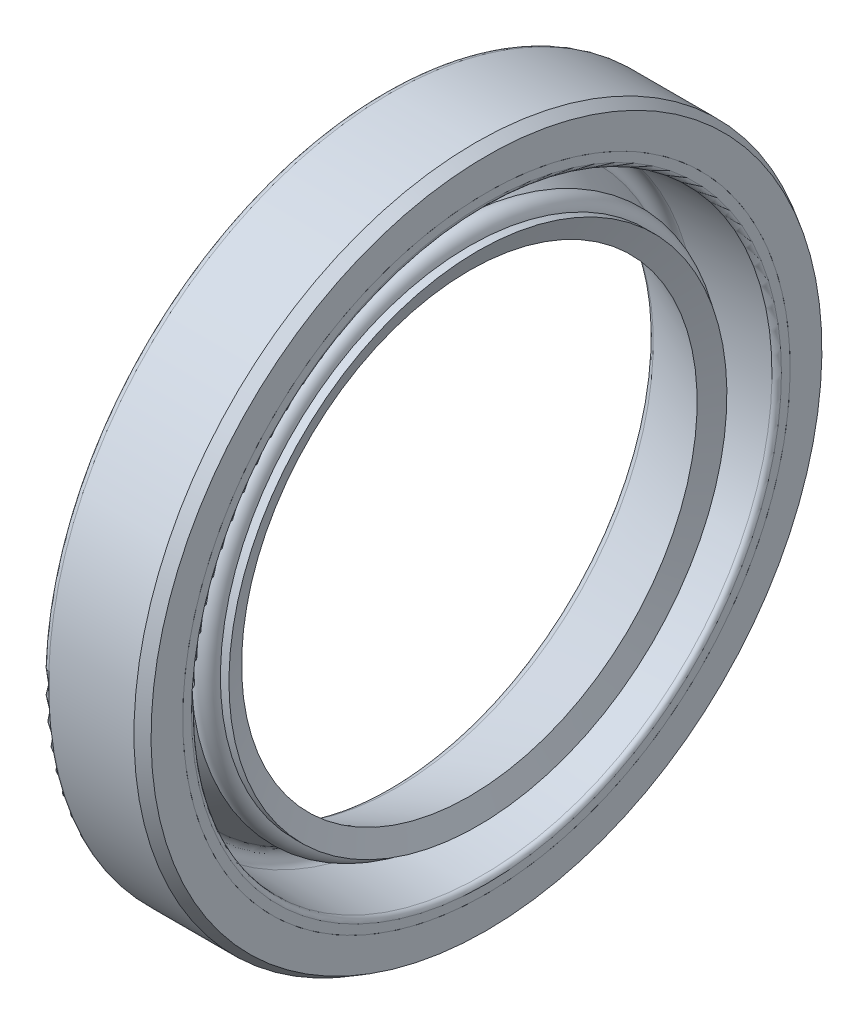
ISO-10303-21;
HEADER;
FILE_DESCRIPTION(('STEP AP214'),'2;1');
FILE_NAME('part.step','',(''),(''),'','','');
FILE_SCHEMA(('AUTOMOTIVE_DESIGN { 1 0 10303 214 1 1 1 1 }'));
ENDSEC;
DATA;
#1=APPLICATION_CONTEXT('core data for automotive mechanical design processes');
#2=APPLICATION_PROTOCOL_DEFINITION('international standard','automotive_design',2000,#1);
#3=PRODUCT_CONTEXT('',#1,'mechanical');
#4=PRODUCT('Part','Part','',(#3));
#5=PRODUCT_RELATED_PRODUCT_CATEGORY('part','',(#4));
#6=PRODUCT_DEFINITION_FORMATION('','',#4);
#7=PRODUCT_DEFINITION_CONTEXT('part definition',#1,'design');
#8=PRODUCT_DEFINITION('design','',#6,#7);
#9=PRODUCT_DEFINITION_SHAPE('','',#8);
#10=(LENGTH_UNIT() NAMED_UNIT(*) SI_UNIT(.MILLI.,.METRE.));
#11=(NAMED_UNIT(*) PLANE_ANGLE_UNIT() SI_UNIT($,.RADIAN.));
#12=(NAMED_UNIT(*) SI_UNIT($,.STERADIAN.) SOLID_ANGLE_UNIT());
#13=UNCERTAINTY_MEASURE_WITH_UNIT(LENGTH_MEASURE(1.E-05),#10,'distance_accuracy_value','');
#14=(GEOMETRIC_REPRESENTATION_CONTEXT(3) GLOBAL_UNCERTAINTY_ASSIGNED_CONTEXT((#13)) GLOBAL_UNIT_ASSIGNED_CONTEXT((#10,
#11,#12)) REPRESENTATION_CONTEXT('',''));
#15=CARTESIAN_POINT('',(0.,0.,0.));
#16=DIRECTION('',(0.,0.,1.));
#17=DIRECTION('',(1.,0.,0.));
#18=AXIS2_PLACEMENT_3D('',#15,#16,#17);
#19=CARTESIAN_POINT('',(10.1408439473113,0.,0.));
#20=DIRECTION('',(-1.,0.,0.));
#21=DIRECTION('',(0.,0.,1.));
#22=AXIS2_PLACEMENT_3D('',#19,#20,#21);
#23=TOROIDAL_SURFACE('',#22,34.502972869853,1.787525);
#24=CARTESIAN_POINT('',(10.1408439473113,0.,36.290497869853));
#25=VERTEX_POINT('',#24);
#26=VERTEX_LOOP('',#25);
#27=FACE_BOUND('',#26,.T.);
#28=ADVANCED_FACE('F54',(#27),#23,.T.);
#29=CLOSED_SHELL('',(#28));
#30=MANIFOLD_SOLID_BREP('B2',#29);
#31=CARTESIAN_POINT('',(3.51549062980086,0.,0.));
#32=DIRECTION('',(1.,0.,0.));
#33=DIRECTION('',(0.,1.,0.));
#34=AXIS2_PLACEMENT_3D('',#31,#32,#33);
#35=CONICAL_SURFACE('',#34,40.093772548186,0.0349065850398807);
#36=CARTESIAN_POINT('',(13.6532720210662,0.,0.));
#37=DIRECTION('',(1.,0.,0.));
#38=DIRECTION('',(0.,1.,0.));
#39=AXIS2_PLACEMENT_3D('',#36,#37,#38);
#40=CIRCLE('',#39,40.4477916753081);
#41=CARTESIAN_POINT('',(13.6532720210662,40.4477916753081,0.));
#42=VERTEX_POINT('',#41);
#43=EDGE_CURVE('E53',#42,#42,#40,.T.);
#44=ORIENTED_EDGE('',*,*,#43,.T.);
#45=EDGE_LOOP('',(#44));
#46=FACE_BOUND('',#45,.T.);
#47=CARTESIAN_POINT('',(3.51549062980086,0.,0.));
#48=DIRECTION('',(1.,0.,0.));
#49=DIRECTION('',(0.,1.,0.));
#50=AXIS2_PLACEMENT_3D('',#47,#48,#49);
#51=CIRCLE('',#50,40.093772548186);
#52=CARTESIAN_POINT('',(3.51549062980086,40.093772548186,0.));
#53=VERTEX_POINT('',#52);
#54=EDGE_CURVE('E119',#53,#53,#51,.T.);
#55=ORIENTED_EDGE('',*,*,#54,.F.);
#56=EDGE_LOOP('',(#55));
#57=FACE_BOUND('',#56,.T.);
#58=ADVANCED_FACE('F79',(#46,#57),#35,.F.);
#59=CARTESIAN_POINT('',(13.629878125,0.,0.));
#60=DIRECTION('',(1.,0.,0.));
#61=DIRECTION('',(0.,1.,0.));
#62=AXIS2_PLACEMENT_3D('',#59,#60,#61);
#63=TOROIDAL_SURFACE('',#62,41.1177052083333,0.670321875000005);
#64=CARTESIAN_POINT('',(14.3002,0.,0.));
#65=DIRECTION('',(1.,0.,0.));
#66=DIRECTION('',(0.,1.,0.));
#67=AXIS2_PLACEMENT_3D('',#64,#65,#66);
#68=CIRCLE('',#67,41.1177052083333);
#69=CARTESIAN_POINT('',(14.3002,41.1177052083333,0.));
#70=VERTEX_POINT('',#69);
#71=EDGE_CURVE('E85',#70,#70,#68,.T.);
#72=ORIENTED_EDGE('',*,*,#71,.T.);
#73=EDGE_LOOP('',(#72));
#74=FACE_BOUND('',#73,.T.);
#75=ORIENTED_EDGE('',*,*,#43,.F.);
#76=EDGE_LOOP('',(#75));
#77=FACE_BOUND('',#76,.T.);
#78=ADVANCED_FACE('F127',(#74,#77),#63,.T.);
#79=CARTESIAN_POINT('',(14.3002,0.,0.));
#80=DIRECTION('',(1.,0.,0.));
#81=DIRECTION('',(0.,1.,0.));
#82=AXIS2_PLACEMENT_3D('',#79,#80,#81);
#83=PLANE('',#82);
#84=CARTESIAN_POINT('',(14.3002,0.,0.));
#85=DIRECTION('',(1.,0.,0.));
#86=DIRECTION('',(0.,1.,0.));
#87=AXIS2_PLACEMENT_3D('',#84,#85,#86);
#88=CIRCLE('',#87,42.3333333333333);
#89=CARTESIAN_POINT('',(14.3002,42.3333333333333,0.));
#90=VERTEX_POINT('',#89);
#91=EDGE_CURVE('E89',#90,#90,#88,.T.);
#92=ORIENTED_EDGE('',*,*,#91,.T.);
#93=EDGE_LOOP('',(#92));
#94=FACE_BOUND('',#93,.T.);
#95=ORIENTED_EDGE('',*,*,#71,.F.);
#96=EDGE_LOOP('',(#95));
#97=FACE_BOUND('',#96,.T.);
#98=ADVANCED_FACE('F131',(#94,#97),#83,.T.);
#99=CARTESIAN_POINT('',(14.3002,0.,0.));
#100=DIRECTION('',(1.,0.,0.));
#101=DIRECTION('',(0.,1.,0.));
#102=AXIS2_PLACEMENT_3D('',#99,#100,#101);
#103=CYLINDRICAL_SURFACE('',#102,42.3333333333333);
#104=CARTESIAN_POINT('',(0.,0.,0.));
#105=DIRECTION('',(1.,0.,0.));
#106=DIRECTION('',(0.,1.,0.));
#107=AXIS2_PLACEMENT_3D('',#104,#105,#106);
#108=CIRCLE('',#107,42.3333333333333);
#109=CARTESIAN_POINT('',(0.,42.3333333333333,0.));
#110=VERTEX_POINT('',#109);
#111=EDGE_CURVE('E93',#110,#110,#108,.T.);
#112=ORIENTED_EDGE('',*,*,#111,.T.);
#113=EDGE_LOOP('',(#112));
#114=FACE_BOUND('',#113,.T.);
#115=ORIENTED_EDGE('',*,*,#91,.F.);
#116=EDGE_LOOP('',(#115));
#117=FACE_BOUND('',#116,.T.);
#118=ADVANCED_FACE('F135',(#114,#117),#103,.T.);
#119=CARTESIAN_POINT('',(0.,0.,0.));
#120=DIRECTION('',(-1.,0.,0.));
#121=DIRECTION('',(0.,-1.,0.));
#122=AXIS2_PLACEMENT_3D('',#119,#120,#121);
#123=PLANE('',#122);
#124=CARTESIAN_POINT('',(0.,0.,0.));
#125=DIRECTION('',(1.,0.,0.));
#126=DIRECTION('',(0.,1.,0.));
#127=AXIS2_PLACEMENT_3D('',#124,#125,#126);
#128=CIRCLE('',#127,38.3645833333333);
#129=CARTESIAN_POINT('',(0.,38.3645833333333,0.));
#130=VERTEX_POINT('',#129);
#131=EDGE_CURVE('E98',#130,#130,#128,.T.);
#132=ORIENTED_EDGE('',*,*,#131,.T.);
#133=EDGE_LOOP('',(#132));
#134=FACE_BOUND('',#133,.T.);
#135=ORIENTED_EDGE('',*,*,#111,.F.);
#136=EDGE_LOOP('',(#135));
#137=FACE_BOUND('',#136,.T.);
#138=ADVANCED_FACE('F142',(#134,#137),#123,.T.);
#139=CARTESIAN_POINT('',(2.6812875,0.,0.));
#140=DIRECTION('',(1.,0.,0.));
#141=DIRECTION('',(0.,1.,0.));
#142=AXIS2_PLACEMENT_3D('',#139,#140,#141);
#143=TOROIDAL_SURFACE('',#142,38.3645833333333,2.6812875);
#144=CARTESIAN_POINT('',(1.67867231544544,0.,0.));
#145=DIRECTION('',(1.,0.,0.));
#146=DIRECTION('',(0.,1.,0.));
#147=AXIS2_PLACEMENT_3D('',#144,#145,#146);
#148=CIRCLE('',#147,35.8778052070509);
#149=CARTESIAN_POINT('',(1.67867231544544,35.8778052070509,0.));
#150=VERTEX_POINT('',#149);
#151=EDGE_CURVE('E101',#150,#150,#148,.T.);
#152=ORIENTED_EDGE('',*,*,#151,.T.);
#153=EDGE_LOOP('',(#152));
#154=FACE_BOUND('',#153,.T.);
#155=ORIENTED_EDGE('',*,*,#131,.F.);
#156=EDGE_LOOP('',(#155));
#157=FACE_BOUND('',#156,.T.);
#158=ADVANCED_FACE('F146',(#154,#157),#143,.T.);
#159=CARTESIAN_POINT('',(1.67867231544544,0.,0.));
#160=DIRECTION('',(-1.,0.,0.));
#161=DIRECTION('',(0.,-1.,0.));
#162=AXIS2_PLACEMENT_3D('',#159,#160,#161);
#163=CONICAL_SURFACE('',#162,35.8778052070509,0.383243356151814);
#164=CARTESIAN_POINT('',(11.9168333333333,0.,0.));
#165=DIRECTION('',(1.,0.,0.));
#166=DIRECTION('',(0.,1.,0.));
#167=AXIS2_PLACEMENT_3D('',#164,#165,#166);
#168=CIRCLE('',#167,31.75);
#169=CARTESIAN_POINT('',(11.9168333333333,31.75,0.));
#170=VERTEX_POINT('',#169);
#171=EDGE_CURVE('E104',#170,#170,#168,.T.);
#172=ORIENTED_EDGE('',*,*,#171,.T.);
#173=EDGE_LOOP('',(#172));
#174=FACE_BOUND('',#173,.T.);
#175=ORIENTED_EDGE('',*,*,#151,.F.);
#176=EDGE_LOOP('',(#175));
#177=FACE_BOUND('',#176,.T.);
#178=ADVANCED_FACE('F150',(#174,#177),#163,.F.);
#179=CARTESIAN_POINT('',(11.9168333333333,0.,0.));
#180=DIRECTION('',(1.,0.,0.));
#181=DIRECTION('',(0.,1.,0.));
#182=AXIS2_PLACEMENT_3D('',#179,#180,#181);
#183=CONICAL_SURFACE('',#182,31.75,1.18755297064308);
#184=CARTESIAN_POINT('',(13.1085166666667,0.,0.));
#185=DIRECTION('',(1.,0.,0.));
#186=DIRECTION('',(0.,1.,0.));
#187=AXIS2_PLACEMENT_3D('',#184,#185,#186);
#188=CIRCLE('',#187,34.7057222875148);
#189=CARTESIAN_POINT('',(13.1085166666667,34.7057222875148,0.));
#190=VERTEX_POINT('',#189);
#191=EDGE_CURVE('E107',#190,#190,#188,.T.);
#192=ORIENTED_EDGE('',*,*,#191,.T.);
#193=EDGE_LOOP('',(#192));
#194=FACE_BOUND('',#193,.T.);
#195=ORIENTED_EDGE('',*,*,#171,.F.);
#196=EDGE_LOOP('',(#195));
#197=FACE_BOUND('',#196,.T.);
#198=ADVANCED_FACE('F154',(#194,#197),#183,.F.);
#199=CARTESIAN_POINT('',(14.3002,0.,0.));
#200=DIRECTION('',(1.,0.,0.));
#201=DIRECTION('',(0.,1.,0.));
#202=AXIS2_PLACEMENT_3D('',#199,#200,#201);
#203=CYLINDRICAL_SURFACE('',#202,34.7057222875148);
#204=CARTESIAN_POINT('',(11.9168333333333,0.,0.));
#205=DIRECTION('',(1.,0.,0.));
#206=DIRECTION('',(0.,1.,0.));
#207=AXIS2_PLACEMENT_3D('',#204,#205,#206);
#208=CIRCLE('',#207,34.7057222875148);
#209=CARTESIAN_POINT('',(11.9168333333333,34.7057222875148,0.));
#210=VERTEX_POINT('',#209);
#211=EDGE_CURVE('E110',#210,#210,#208,.T.);
#212=ORIENTED_EDGE('',*,*,#211,.T.);
#213=EDGE_LOOP('',(#212));
#214=FACE_BOUND('',#213,.T.);
#215=ORIENTED_EDGE('',*,*,#191,.F.);
#216=EDGE_LOOP('',(#215));
#217=FACE_BOUND('',#216,.T.);
#218=ADVANCED_FACE('F158',(#214,#217),#203,.T.);
#219=CARTESIAN_POINT('',(10.1408439473113,0.,0.));
#220=DIRECTION('',(1.,0.,0.));
#221=DIRECTION('',(0.,1.,0.));
#222=AXIS2_PLACEMENT_3D('',#219,#220,#221);
#223=TOROIDAL_SURFACE('',#222,34.502972869853,1.787525);
#224=ORIENTED_EDGE('',*,*,#211,.F.);
#225=EDGE_LOOP('',(#224));
#226=FACE_BOUND('',#225,.T.);
#227=CARTESIAN_POINT('',(8.52552273019092,0.,0.));
#228=DIRECTION('',(1.,0.,0.));
#229=DIRECTION('',(0.,1.,0.));
#230=AXIS2_PLACEMENT_3D('',#227,#228,#229);
#231=CIRCLE('',#230,35.2684681285879);
#232=CARTESIAN_POINT('',(8.52552273019092,35.2684681285879,0.));
#233=VERTEX_POINT('',#232);
#234=EDGE_CURVE('E113',#233,#233,#231,.T.);
#235=ORIENTED_EDGE('',*,*,#234,.T.);
#236=EDGE_LOOP('',(#235));
#237=FACE_BOUND('',#236,.T.);
#238=ADVANCED_FACE('F162',(#226,#237),#223,.F.);
#239=CARTESIAN_POINT('',(3.05407368437188,0.,0.));
#240=DIRECTION('',(-1.,0.,0.));
#241=DIRECTION('',(0.,-1.,0.));
#242=AXIS2_PLACEMENT_3D('',#239,#240,#241);
#243=CONICAL_SURFACE('',#242,37.8613693166566,0.442547689304423);
#244=ORIENTED_EDGE('',*,*,#234,.F.);
#245=EDGE_LOOP('',(#244));
#246=FACE_BOUND('',#245,.T.);
#247=CARTESIAN_POINT('',(3.05407368437188,0.,0.));
#248=DIRECTION('',(1.,0.,0.));
#249=DIRECTION('',(0.,1.,0.));
#250=AXIS2_PLACEMENT_3D('',#247,#248,#249);
#251=CIRCLE('',#250,37.8613693166566);
#252=CARTESIAN_POINT('',(3.05407368437188,37.8613693166566,0.));
#253=VERTEX_POINT('',#252);
#254=EDGE_CURVE('E116',#253,#253,#251,.T.);
#255=ORIENTED_EDGE('',*,*,#254,.T.);
#256=EDGE_LOOP('',(#255));
#257=FACE_BOUND('',#256,.T.);
#258=ADVANCED_FACE('F166',(#246,#257),#243,.T.);
#259=CARTESIAN_POINT('',(3.55642994791667,0.,0.));
#260=DIRECTION('',(1.,0.,0.));
#261=DIRECTION('',(0.,1.,0.));
#262=AXIS2_PLACEMENT_3D('',#259,#260,#261);
#263=TOROIDAL_SURFACE('',#262,38.9214238653919,1.17306328124999);
#264=ORIENTED_EDGE('',*,*,#54,.T.);
#265=EDGE_LOOP('',(#264));
#266=FACE_BOUND('',#265,.T.);
#267=ORIENTED_EDGE('',*,*,#254,.F.);
#268=EDGE_LOOP('',(#267));
#269=FACE_BOUND('',#268,.T.);
#270=ADVANCED_FACE('F123',(#266,#269),#263,.F.);
#271=CLOSED_SHELL('',(#58,#78,#98,#118,#138,#158,#178,#198,#218,#238,#258,#270));
#272=MANIFOLD_SOLID_BREP('B7',#271);
#273=CARTESIAN_POINT('',(14.3002,0.,0.));
#274=DIRECTION('',(-1.,0.,0.));
#275=DIRECTION('',(0.,-1.,0.));
#276=AXIS2_PLACEMENT_3D('',#273,#274,#275);
#277=CYLINDRICAL_SURFACE('',#276,47.625);
#278=CARTESIAN_POINT('',(0.893762499999999,0.,0.));
#279=DIRECTION('',(-1.,0.,0.));
#280=DIRECTION('',(0.,-1.,0.));
#281=AXIS2_PLACEMENT_3D('',#278,#279,#280);
#282=CIRCLE('',#281,47.625);
#283=CARTESIAN_POINT('',(0.893762499999999,-47.625,0.));
#284=VERTEX_POINT('',#283);
#285=EDGE_CURVE('E78',#284,#284,#282,.T.);
#286=ORIENTED_EDGE('',*,*,#285,.F.);
#287=EDGE_LOOP('',(#286));
#288=FACE_BOUND('',#287,.T.);
#289=CARTESIAN_POINT('',(12.79197578125,0.,0.));
#290=DIRECTION('',(-1.,0.,0.));
#291=DIRECTION('',(0.,-1.,0.));
#292=AXIS2_PLACEMENT_3D('',#289,#290,#291);
#293=CIRCLE('',#292,47.625);
#294=CARTESIAN_POINT('',(12.79197578125,-47.625,0.));
#295=VERTEX_POINT('',#294);
#296=EDGE_CURVE('E283',#295,#295,#293,.T.);
#297=ORIENTED_EDGE('',*,*,#296,.T.);
#298=EDGE_LOOP('',(#297));
#299=FACE_BOUND('',#298,.T.);
#300=ADVANCED_FACE('F261',(#288,#299),#277,.T.);
#301=CARTESIAN_POINT('',(0.8937625,0.,0.));
#302=DIRECTION('',(-1.,0.,0.));
#303=DIRECTION('',(0.,-1.,0.));
#304=AXIS2_PLACEMENT_3D('',#301,#302,#303);
#305=TOROIDAL_SURFACE('',#304,46.7312375,0.893762499999999);
#306=CARTESIAN_POINT('',(0.,0.,0.));
#307=DIRECTION('',(-1.,0.,0.));
#308=DIRECTION('',(0.,-1.,0.));
#309=AXIS2_PLACEMENT_3D('',#306,#307,#308);
#310=CIRCLE('',#309,46.7312375);
#311=CARTESIAN_POINT('',(0.,-46.7312375,0.));
#312=VERTEX_POINT('',#311);
#313=EDGE_CURVE('E267',#312,#312,#310,.T.);
#314=ORIENTED_EDGE('',*,*,#313,.F.);
#315=EDGE_LOOP('',(#314));
#316=FACE_BOUND('',#315,.T.);
#317=ORIENTED_EDGE('',*,*,#285,.T.);
#318=EDGE_LOOP('',(#317));
#319=FACE_BOUND('',#318,.T.);
#320=ADVANCED_FACE('F300',(#316,#319),#305,.T.);
#321=CARTESIAN_POINT('',(0.,0.,0.));
#322=DIRECTION('',(1.,0.,0.));
#323=DIRECTION('',(0.,1.,0.));
#324=AXIS2_PLACEMENT_3D('',#321,#322,#323);
#325=PLANE('',#324);
#326=CARTESIAN_POINT('',(0.,0.,0.));
#327=DIRECTION('',(-1.,0.,0.));
#328=DIRECTION('',(0.,-1.,0.));
#329=AXIS2_PLACEMENT_3D('',#326,#327,#328);
#330=CIRCLE('',#329,42.3333333333333);
#331=CARTESIAN_POINT('',(0.,-42.3333333333333,0.));
#332=VERTEX_POINT('',#331);
#333=EDGE_CURVE('E271',#332,#332,#330,.T.);
#334=ORIENTED_EDGE('',*,*,#333,.F.);
#335=EDGE_LOOP('',(#334));
#336=FACE_BOUND('',#335,.T.);
#337=ORIENTED_EDGE('',*,*,#313,.T.);
#338=EDGE_LOOP('',(#337));
#339=FACE_BOUND('',#338,.T.);
#340=ADVANCED_FACE('F305',(#336,#339),#325,.F.);
#341=CARTESIAN_POINT('',(14.3002,0.,0.));
#342=DIRECTION('',(-1.,0.,0.));
#343=DIRECTION('',(0.,-1.,0.));
#344=AXIS2_PLACEMENT_3D('',#341,#342,#343);
#345=CYLINDRICAL_SURFACE('',#344,42.3333333333333);
#346=ORIENTED_EDGE('',*,*,#333,.T.);
#347=EDGE_LOOP('',(#346));
#348=FACE_BOUND('',#347,.T.);
#349=CARTESIAN_POINT('',(14.3002,0.,0.));
#350=DIRECTION('',(-1.,0.,0.));
#351=DIRECTION('',(0.,-1.,0.));
#352=AXIS2_PLACEMENT_3D('',#349,#350,#351);
#353=CIRCLE('',#352,42.3333333333333);
#354=CARTESIAN_POINT('',(14.3002,-42.3333333333333,0.));
#355=VERTEX_POINT('',#354);
#356=EDGE_CURVE('E275',#355,#355,#353,.T.);
#357=ORIENTED_EDGE('',*,*,#356,.F.);
#358=EDGE_LOOP('',(#357));
#359=FACE_BOUND('',#358,.T.);
#360=ADVANCED_FACE('F296',(#348,#359),#345,.F.);
#361=CARTESIAN_POINT('',(14.3002,0.,0.));
#362=DIRECTION('',(-1.,0.,0.));
#363=DIRECTION('',(0.,-1.,0.));
#364=AXIS2_PLACEMENT_3D('',#361,#362,#363);
#365=PLANE('',#364);
#366=CARTESIAN_POINT('',(14.3002,0.,0.));
#367=DIRECTION('',(-1.,0.,0.));
#368=DIRECTION('',(0.,-1.,0.));
#369=AXIS2_PLACEMENT_3D('',#366,#367,#368);
#370=CIRCLE('',#369,46.7542263413064);
#371=CARTESIAN_POINT('',(14.3002,-46.7542263413064,0.));
#372=VERTEX_POINT('',#371);
#373=EDGE_CURVE('E280',#372,#372,#370,.T.);
#374=ORIENTED_EDGE('',*,*,#373,.F.);
#375=EDGE_LOOP('',(#374));
#376=FACE_BOUND('',#375,.T.);
#377=ORIENTED_EDGE('',*,*,#356,.T.);
#378=EDGE_LOOP('',(#377));
#379=FACE_BOUND('',#378,.T.);
#380=ADVANCED_FACE('F290',(#376,#379),#365,.F.);
#381=CARTESIAN_POINT('',(12.79197578125,0.,0.));
#382=DIRECTION('',(-1.,0.,0.));
#383=DIRECTION('',(0.,-1.,0.));
#384=AXIS2_PLACEMENT_3D('',#381,#382,#383);
#385=CONICAL_SURFACE('',#384,47.625,0.523598775598308);
#386=ORIENTED_EDGE('',*,*,#373,.T.);
#387=EDGE_LOOP('',(#386));
#388=FACE_BOUND('',#387,.T.);
#389=ORIENTED_EDGE('',*,*,#296,.F.);
#390=EDGE_LOOP('',(#389));
#391=FACE_BOUND('',#390,.T.);
#392=ADVANCED_FACE('F288',(#388,#391),#385,.T.);
#393=CLOSED_SHELL('',(#300,#320,#340,#360,#380,#392));
#394=MANIFOLD_SOLID_BREP('B48',#393);
#395=ADVANCED_BREP_SHAPE_REPRESENTATION('',(#18,#30,#272,#394),#14);
#396=SHAPE_DEFINITION_REPRESENTATION(#9,#395);
ENDSEC;
END-ISO-10303-21;
